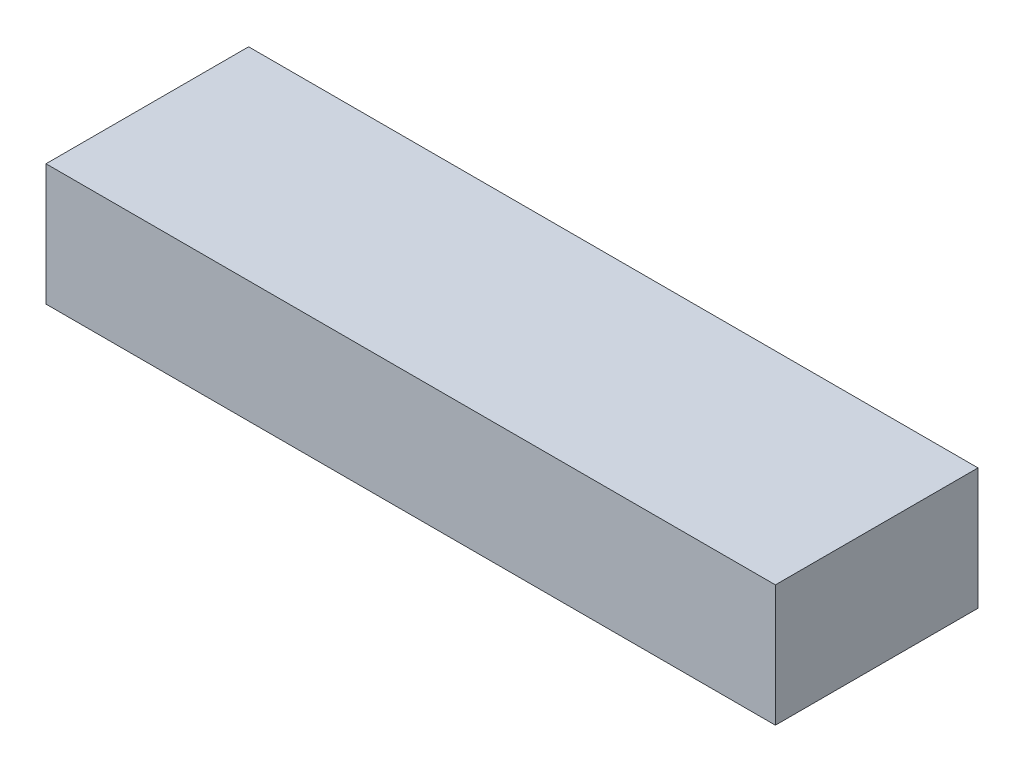
ISO-10303-21;
HEADER;
FILE_DESCRIPTION(('STEP AP214'),'2;1');
FILE_NAME('part.step','',(''),(''),'','','');
FILE_SCHEMA(('AUTOMOTIVE_DESIGN { 1 0 10303 214 1 1 1 1 }'));
ENDSEC;
DATA;
#1=APPLICATION_CONTEXT('core data for automotive mechanical design processes');
#2=APPLICATION_PROTOCOL_DEFINITION('international standard','automotive_design',2000,#1);
#3=PRODUCT_CONTEXT('',#1,'mechanical');
#4=PRODUCT('Part','Part','',(#3));
#5=PRODUCT_RELATED_PRODUCT_CATEGORY('part','',(#4));
#6=PRODUCT_DEFINITION_FORMATION('','',#4);
#7=PRODUCT_DEFINITION_CONTEXT('part definition',#1,'design');
#8=PRODUCT_DEFINITION('design','',#6,#7);
#9=PRODUCT_DEFINITION_SHAPE('','',#8);
#10=(LENGTH_UNIT() NAMED_UNIT(*) SI_UNIT(.MILLI.,.METRE.));
#11=(NAMED_UNIT(*) PLANE_ANGLE_UNIT() SI_UNIT($,.RADIAN.));
#12=(NAMED_UNIT(*) SI_UNIT($,.STERADIAN.) SOLID_ANGLE_UNIT());
#13=UNCERTAINTY_MEASURE_WITH_UNIT(LENGTH_MEASURE(1.E-05),#10,'distance_accuracy_value','');
#14=(GEOMETRIC_REPRESENTATION_CONTEXT(3) GLOBAL_UNCERTAINTY_ASSIGNED_CONTEXT((#13)) GLOBAL_UNIT_ASSIGNED_CONTEXT((#10,
#11,#12)) REPRESENTATION_CONTEXT('',''));
#15=CARTESIAN_POINT('',(0.,0.,0.));
#16=DIRECTION('',(0.,0.,1.));
#17=DIRECTION('',(1.,0.,0.));
#18=AXIS2_PLACEMENT_3D('',#15,#16,#17);
#19=CARTESIAN_POINT('',(-90.,30.,25.));
#20=DIRECTION('',(1.,0.,0.));
#21=DIRECTION('',(0.,0.,-1.));
#22=AXIS2_PLACEMENT_3D('',#19,#20,#21);
#23=PLANE('',#22);
#24=DIRECTION('',(0.,0.,1.));
#25=VECTOR('',#24,1.);
#26=CARTESIAN_POINT('',(-90.,0.,25.));
#27=LINE('',#26,#25);
#28=CARTESIAN_POINT('',(-90.,0.,-25.));
#29=VERTEX_POINT('',#28);
#30=CARTESIAN_POINT('',(-90.,0.,25.));
#31=VERTEX_POINT('',#30);
#32=EDGE_CURVE('E97',#29,#31,#27,.T.);
#33=ORIENTED_EDGE('',*,*,#32,.T.);
#34=DIRECTION('',(0.,-1.,0.));
#35=VECTOR('',#34,1.);
#36=CARTESIAN_POINT('',(-90.,30.,25.));
#37=LINE('',#36,#35);
#38=CARTESIAN_POINT('',(-90.,30.,25.));
#39=VERTEX_POINT('',#38);
#40=EDGE_CURVE('E11',#39,#31,#37,.T.);
#41=ORIENTED_EDGE('',*,*,#40,.F.);
#42=DIRECTION('',(0.,0.,1.));
#43=VECTOR('',#42,1.);
#44=CARTESIAN_POINT('',(-90.,30.,25.));
#45=LINE('',#44,#43);
#46=CARTESIAN_POINT('',(-90.,30.,-25.));
#47=VERTEX_POINT('',#46);
#48=EDGE_CURVE('E85',#47,#39,#45,.T.);
#49=ORIENTED_EDGE('',*,*,#48,.F.);
#50=DIRECTION('',(0.,-1.,0.));
#51=VECTOR('',#50,1.);
#52=CARTESIAN_POINT('',(-90.,30.,-25.));
#53=LINE('',#52,#51);
#54=EDGE_CURVE('E93',#47,#29,#53,.T.);
#55=ORIENTED_EDGE('',*,*,#54,.T.);
#56=EDGE_LOOP('',(#33,#41,#49,#55));
#57=FACE_BOUND('',#56,.T.);
#58=ADVANCED_FACE('F34',(#57),#23,.F.);
#59=CARTESIAN_POINT('',(90.,30.,25.));
#60=DIRECTION('',(0.,0.,-1.));
#61=DIRECTION('',(-1.,0.,0.));
#62=AXIS2_PLACEMENT_3D('',#59,#60,#61);
#63=PLANE('',#62);
#64=DIRECTION('',(1.,0.,0.));
#65=VECTOR('',#64,1.);
#66=CARTESIAN_POINT('',(90.,0.,25.));
#67=LINE('',#66,#65);
#68=CARTESIAN_POINT('',(90.,0.,25.));
#69=VERTEX_POINT('',#68);
#70=EDGE_CURVE('E89',#31,#69,#67,.T.);
#71=ORIENTED_EDGE('',*,*,#70,.T.);
#72=DIRECTION('',(0.,-1.,0.));
#73=VECTOR('',#72,1.);
#74=CARTESIAN_POINT('',(90.,30.,25.));
#75=LINE('',#74,#73);
#76=CARTESIAN_POINT('',(90.,30.,25.));
#77=VERTEX_POINT('',#76);
#78=EDGE_CURVE('E42',#77,#69,#75,.T.);
#79=ORIENTED_EDGE('',*,*,#78,.F.);
#80=DIRECTION('',(1.,0.,0.));
#81=VECTOR('',#80,1.);
#82=CARTESIAN_POINT('',(90.,30.,25.));
#83=LINE('',#82,#81);
#84=EDGE_CURVE('E80',#39,#77,#83,.T.);
#85=ORIENTED_EDGE('',*,*,#84,.F.);
#86=ORIENTED_EDGE('',*,*,#40,.T.);
#87=EDGE_LOOP('',(#71,#79,#85,#86));
#88=FACE_BOUND('',#87,.T.);
#89=ADVANCED_FACE('F88',(#88),#63,.F.);
#90=CARTESIAN_POINT('',(90.,30.,25.));
#91=DIRECTION('',(-1.,0.,0.));
#92=DIRECTION('',(0.,0.,1.));
#93=AXIS2_PLACEMENT_3D('',#90,#91,#92);
#94=PLANE('',#93);
#95=DIRECTION('',(0.,0.,-1.));
#96=VECTOR('',#95,1.);
#97=CARTESIAN_POINT('',(90.,0.,25.));
#98=LINE('',#97,#96);
#99=CARTESIAN_POINT('',(90.,0.,-25.));
#100=VERTEX_POINT('',#99);
#101=EDGE_CURVE('E67',#69,#100,#98,.T.);
#102=ORIENTED_EDGE('',*,*,#101,.T.);
#103=DIRECTION('',(0.,-1.,0.));
#104=VECTOR('',#103,1.);
#105=CARTESIAN_POINT('',(90.,30.,-25.));
#106=LINE('',#105,#104);
#107=CARTESIAN_POINT('',(90.,30.,-25.));
#108=VERTEX_POINT('',#107);
#109=EDGE_CURVE('E90',#108,#100,#106,.T.);
#110=ORIENTED_EDGE('',*,*,#109,.F.);
#111=DIRECTION('',(0.,0.,-1.));
#112=VECTOR('',#111,1.);
#113=CARTESIAN_POINT('',(90.,30.,25.));
#114=LINE('',#113,#112);
#115=EDGE_CURVE('E83',#77,#108,#114,.T.);
#116=ORIENTED_EDGE('',*,*,#115,.F.);
#117=ORIENTED_EDGE('',*,*,#78,.T.);
#118=EDGE_LOOP('',(#102,#110,#116,#117));
#119=FACE_BOUND('',#118,.T.);
#120=ADVANCED_FACE('F91',(#119),#94,.F.);
#121=CARTESIAN_POINT('',(90.,30.,-25.));
#122=DIRECTION('',(0.,0.,1.));
#123=DIRECTION('',(1.,0.,0.));
#124=AXIS2_PLACEMENT_3D('',#121,#122,#123);
#125=PLANE('',#124);
#126=DIRECTION('',(-1.,0.,0.));
#127=VECTOR('',#126,1.);
#128=CARTESIAN_POINT('',(90.,0.,-25.));
#129=LINE('',#128,#127);
#130=EDGE_CURVE('E73',#100,#29,#129,.T.);
#131=ORIENTED_EDGE('',*,*,#130,.T.);
#132=ORIENTED_EDGE('',*,*,#54,.F.);
#133=DIRECTION('',(-1.,0.,0.));
#134=VECTOR('',#133,1.);
#135=CARTESIAN_POINT('',(90.,30.,-25.));
#136=LINE('',#135,#134);
#137=EDGE_CURVE('E50',#108,#47,#136,.T.);
#138=ORIENTED_EDGE('',*,*,#137,.F.);
#139=ORIENTED_EDGE('',*,*,#109,.T.);
#140=EDGE_LOOP('',(#131,#132,#138,#139));
#141=FACE_BOUND('',#140,.T.);
#142=ADVANCED_FACE('F104',(#141),#125,.F.);
#143=CARTESIAN_POINT('',(0.,30.,0.));
#144=DIRECTION('',(0.,1.,0.));
#145=DIRECTION('',(0.,0.,1.));
#146=AXIS2_PLACEMENT_3D('',#143,#144,#145);
#147=PLANE('',#146);
#148=ORIENTED_EDGE('',*,*,#48,.T.);
#149=ORIENTED_EDGE('',*,*,#84,.T.);
#150=ORIENTED_EDGE('',*,*,#115,.T.);
#151=ORIENTED_EDGE('',*,*,#137,.T.);
#152=EDGE_LOOP('',(#148,#149,#150,#151));
#153=FACE_BOUND('',#152,.T.);
#154=ADVANCED_FACE('F81',(#153),#147,.T.);
#155=CARTESIAN_POINT('',(0.,0.,0.));
#156=DIRECTION('',(0.,1.,0.));
#157=DIRECTION('',(0.,0.,1.));
#158=AXIS2_PLACEMENT_3D('',#155,#156,#157);
#159=PLANE('',#158);
#160=ORIENTED_EDGE('',*,*,#32,.F.);
#161=ORIENTED_EDGE('',*,*,#130,.F.);
#162=ORIENTED_EDGE('',*,*,#101,.F.);
#163=ORIENTED_EDGE('',*,*,#70,.F.);
#164=EDGE_LOOP('',(#160,#161,#162,#163));
#165=FACE_BOUND('',#164,.T.);
#166=ADVANCED_FACE('F107',(#165),#159,.F.);
#167=CLOSED_SHELL('',(#58,#89,#120,#142,#154,#166));
#168=MANIFOLD_SOLID_BREP('B2',#167);
#169=ADVANCED_BREP_SHAPE_REPRESENTATION('',(#18,#168),#14);
#170=SHAPE_DEFINITION_REPRESENTATION(#9,#169);
ENDSEC;
END-ISO-10303-21;
